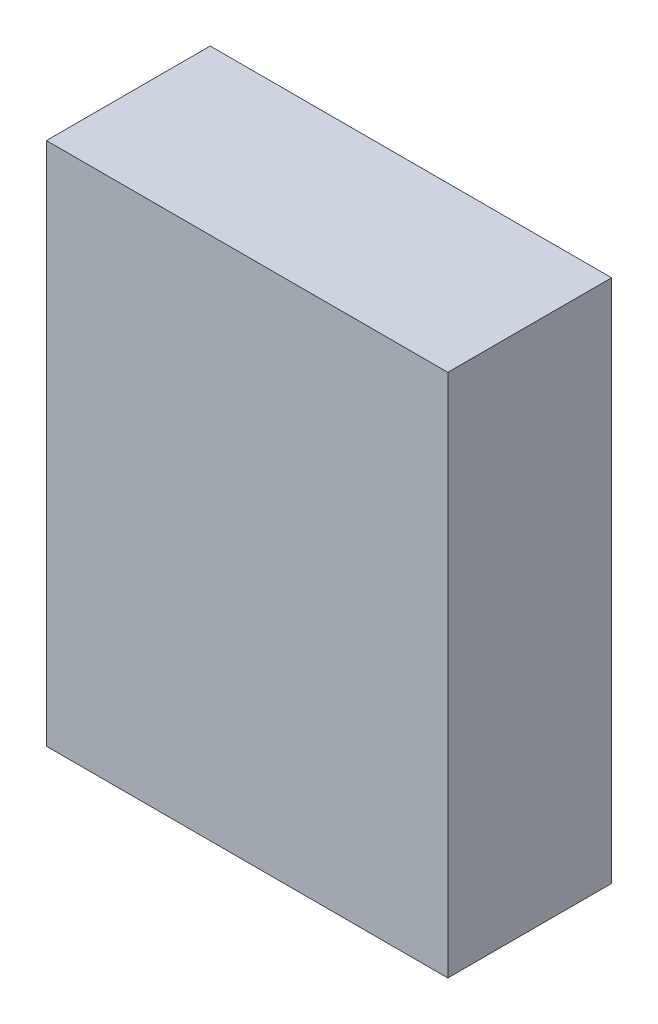
ISO-10303-21;
HEADER;
FILE_DESCRIPTION(('STEP AP214'),'2;1');
FILE_NAME('part.step','',(''),(''),'','','');
FILE_SCHEMA(('AUTOMOTIVE_DESIGN { 1 0 10303 214 1 1 1 1 }'));
ENDSEC;
DATA;
#1=APPLICATION_CONTEXT('core data for automotive mechanical design processes');
#2=APPLICATION_PROTOCOL_DEFINITION('international standard','automotive_design',2000,#1);
#3=PRODUCT_CONTEXT('',#1,'mechanical');
#4=PRODUCT('Part','Part','',(#3));
#5=PRODUCT_RELATED_PRODUCT_CATEGORY('part','',(#4));
#6=PRODUCT_DEFINITION_FORMATION('','',#4);
#7=PRODUCT_DEFINITION_CONTEXT('part definition',#1,'design');
#8=PRODUCT_DEFINITION('design','',#6,#7);
#9=PRODUCT_DEFINITION_SHAPE('','',#8);
#10=(LENGTH_UNIT() NAMED_UNIT(*) SI_UNIT(.MILLI.,.METRE.));
#11=(NAMED_UNIT(*) PLANE_ANGLE_UNIT() SI_UNIT($,.RADIAN.));
#12=(NAMED_UNIT(*) SI_UNIT($,.STERADIAN.) SOLID_ANGLE_UNIT());
#13=UNCERTAINTY_MEASURE_WITH_UNIT(LENGTH_MEASURE(1.E-05),#10,'distance_accuracy_value','');
#14=(GEOMETRIC_REPRESENTATION_CONTEXT(3) GLOBAL_UNCERTAINTY_ASSIGNED_CONTEXT((#13)) GLOBAL_UNIT_ASSIGNED_CONTEXT((#10,
#11,#12)) REPRESENTATION_CONTEXT('',''));
#15=CARTESIAN_POINT('',(0.,0.,0.));
#16=DIRECTION('',(0.,0.,1.));
#17=DIRECTION('',(1.,0.,0.));
#18=AXIS2_PLACEMENT_3D('',#15,#16,#17);
#19=CARTESIAN_POINT('',(0.825,-3.085,1.7));
#20=DIRECTION('',(0.,0.,1.));
#21=DIRECTION('',(1.,0.,0.));
#22=AXIS2_PLACEMENT_3D('',#19,#20,#21);
#23=PLANE('',#22);
#24=DIRECTION('',(0.,1.,0.));
#25=VECTOR('',#24,1.);
#26=CARTESIAN_POINT('',(4.575,-3.085,1.7));
#27=LINE('',#26,#25);
#28=CARTESIAN_POINT('',(4.575,1.815,1.7));
#29=VERTEX_POINT('',#28);
#30=CARTESIAN_POINT('',(4.575,-3.085,1.7));
#31=VERTEX_POINT('',#30);
#32=EDGE_CURVE('E76',#29,#31,#27,.F.);
#33=ORIENTED_EDGE('',*,*,#32,.F.);
#34=DIRECTION('',(1.,0.,0.));
#35=VECTOR('',#34,1.);
#36=CARTESIAN_POINT('',(0.825,1.815,1.7));
#37=LINE('',#36,#35);
#38=CARTESIAN_POINT('',(0.825,1.815,1.7));
#39=VERTEX_POINT('',#38);
#40=EDGE_CURVE('E58',#39,#29,#37,.T.);
#41=ORIENTED_EDGE('',*,*,#40,.F.);
#42=DIRECTION('',(0.,1.,0.));
#43=VECTOR('',#42,1.);
#44=CARTESIAN_POINT('',(0.825,-3.085,1.7));
#45=LINE('',#44,#43);
#46=CARTESIAN_POINT('',(0.825,-3.085,1.7));
#47=VERTEX_POINT('',#46);
#48=EDGE_CURVE('E20',#39,#47,#45,.F.);
#49=ORIENTED_EDGE('',*,*,#48,.T.);
#50=DIRECTION('',(1.,0.,0.));
#51=VECTOR('',#50,1.);
#52=CARTESIAN_POINT('',(0.825,-3.085,1.7));
#53=LINE('',#52,#51);
#54=EDGE_CURVE('E55',#47,#31,#53,.T.);
#55=ORIENTED_EDGE('',*,*,#54,.T.);
#56=EDGE_LOOP('',(#33,#41,#49,#55));
#57=FACE_BOUND('',#56,.T.);
#58=ADVANCED_FACE('F17',(#57),#23,.T.);
#59=CARTESIAN_POINT('',(0.825,-3.085,0.17));
#60=DIRECTION('',(1.,0.,0.));
#61=DIRECTION('',(0.,0.,-1.));
#62=AXIS2_PLACEMENT_3D('',#59,#60,#61);
#63=PLANE('',#62);
#64=DIRECTION('',(0.,0.,1.));
#65=VECTOR('',#64,1.);
#66=CARTESIAN_POINT('',(0.825,1.815,0.17));
#67=LINE('',#66,#65);
#68=CARTESIAN_POINT('',(0.825,1.815,0.17));
#69=VERTEX_POINT('',#68);
#70=EDGE_CURVE('E78',#69,#39,#67,.T.);
#71=ORIENTED_EDGE('',*,*,#70,.F.);
#72=DIRECTION('',(0.,1.,0.));
#73=VECTOR('',#72,1.);
#74=CARTESIAN_POINT('',(0.825,-3.085,0.17));
#75=LINE('',#74,#73);
#76=CARTESIAN_POINT('',(0.825,-3.085,0.17));
#77=VERTEX_POINT('',#76);
#78=EDGE_CURVE('E73',#69,#77,#75,.F.);
#79=ORIENTED_EDGE('',*,*,#78,.T.);
#80=DIRECTION('',(0.,0.,1.));
#81=VECTOR('',#80,1.);
#82=CARTESIAN_POINT('',(0.825,-3.085,0.17));
#83=LINE('',#82,#81);
#84=EDGE_CURVE('E63',#77,#47,#83,.T.);
#85=ORIENTED_EDGE('',*,*,#84,.T.);
#86=ORIENTED_EDGE('',*,*,#48,.F.);
#87=EDGE_LOOP('',(#71,#79,#85,#86));
#88=FACE_BOUND('',#87,.T.);
#89=ADVANCED_FACE('F72',(#88),#63,.F.);
#90=CARTESIAN_POINT('',(0.825,-3.085,0.17));
#91=DIRECTION('',(0.,1.,0.));
#92=DIRECTION('',(0.,0.,1.));
#93=AXIS2_PLACEMENT_3D('',#90,#91,#92);
#94=PLANE('',#93);
#95=ORIENTED_EDGE('',*,*,#54,.F.);
#96=ORIENTED_EDGE('',*,*,#84,.F.);
#97=DIRECTION('',(1.,0.,0.));
#98=VECTOR('',#97,1.);
#99=CARTESIAN_POINT('',(0.825,-3.085,0.17));
#100=LINE('',#99,#98);
#101=CARTESIAN_POINT('',(4.575,-3.085,0.17));
#102=VERTEX_POINT('',#101);
#103=EDGE_CURVE('E83',#77,#102,#100,.T.);
#104=ORIENTED_EDGE('',*,*,#103,.T.);
#105=DIRECTION('',(0.,0.,-1.));
#106=VECTOR('',#105,1.);
#107=CARTESIAN_POINT('',(4.575,-3.085,0.17));
#108=LINE('',#107,#106);
#109=EDGE_CURVE('E69',#31,#102,#108,.T.);
#110=ORIENTED_EDGE('',*,*,#109,.F.);
#111=EDGE_LOOP('',(#95,#96,#104,#110));
#112=FACE_BOUND('',#111,.T.);
#113=ADVANCED_FACE('F66',(#112),#94,.F.);
#114=CARTESIAN_POINT('',(4.575,-3.085,0.17));
#115=DIRECTION('',(1.,0.,0.));
#116=DIRECTION('',(0.,0.,-1.));
#117=AXIS2_PLACEMENT_3D('',#114,#115,#116);
#118=PLANE('',#117);
#119=DIRECTION('',(0.,0.,1.));
#120=VECTOR('',#119,1.);
#121=CARTESIAN_POINT('',(4.575,1.815,0.17));
#122=LINE('',#121,#120);
#123=CARTESIAN_POINT('',(4.575,1.815,0.17));
#124=VERTEX_POINT('',#123);
#125=EDGE_CURVE('E34',#29,#124,#122,.F.);
#126=ORIENTED_EDGE('',*,*,#125,.F.);
#127=ORIENTED_EDGE('',*,*,#32,.T.);
#128=ORIENTED_EDGE('',*,*,#109,.T.);
#129=DIRECTION('',(0.,1.,0.));
#130=VECTOR('',#129,1.);
#131=CARTESIAN_POINT('',(4.575,-3.085,0.17));
#132=LINE('',#131,#130);
#133=EDGE_CURVE('E26',#102,#124,#132,.T.);
#134=ORIENTED_EDGE('',*,*,#133,.T.);
#135=EDGE_LOOP('',(#126,#127,#128,#134));
#136=FACE_BOUND('',#135,.T.);
#137=ADVANCED_FACE('F88',(#136),#118,.T.);
#138=CARTESIAN_POINT('',(0.825,1.815,0.17));
#139=DIRECTION('',(0.,1.,0.));
#140=DIRECTION('',(0.,0.,1.));
#141=AXIS2_PLACEMENT_3D('',#138,#139,#140);
#142=PLANE('',#141);
#143=ORIENTED_EDGE('',*,*,#40,.T.);
#144=ORIENTED_EDGE('',*,*,#125,.T.);
#145=DIRECTION('',(1.,0.,0.));
#146=VECTOR('',#145,1.);
#147=CARTESIAN_POINT('',(0.825,1.815,0.17));
#148=LINE('',#147,#146);
#149=EDGE_CURVE('E11',#124,#69,#148,.F.);
#150=ORIENTED_EDGE('',*,*,#149,.T.);
#151=ORIENTED_EDGE('',*,*,#70,.T.);
#152=EDGE_LOOP('',(#143,#144,#150,#151));
#153=FACE_BOUND('',#152,.T.);
#154=ADVANCED_FACE('F91',(#153),#142,.T.);
#155=CARTESIAN_POINT('',(0.825,-3.085,0.17));
#156=DIRECTION('',(0.,0.,1.));
#157=DIRECTION('',(1.,0.,0.));
#158=AXIS2_PLACEMENT_3D('',#155,#156,#157);
#159=PLANE('',#158);
#160=ORIENTED_EDGE('',*,*,#133,.F.);
#161=ORIENTED_EDGE('',*,*,#103,.F.);
#162=ORIENTED_EDGE('',*,*,#78,.F.);
#163=ORIENTED_EDGE('',*,*,#149,.F.);
#164=EDGE_LOOP('',(#160,#161,#162,#163));
#165=FACE_BOUND('',#164,.T.);
#166=ADVANCED_FACE('F90',(#165),#159,.F.);
#167=CLOSED_SHELL('',(#58,#89,#113,#137,#154,#166));
#168=MANIFOLD_SOLID_BREP('B1',#167);
#169=ADVANCED_BREP_SHAPE_REPRESENTATION('',(#18,#168),#14);
#170=SHAPE_DEFINITION_REPRESENTATION(#9,#169);
ENDSEC;
END-ISO-10303-21;
